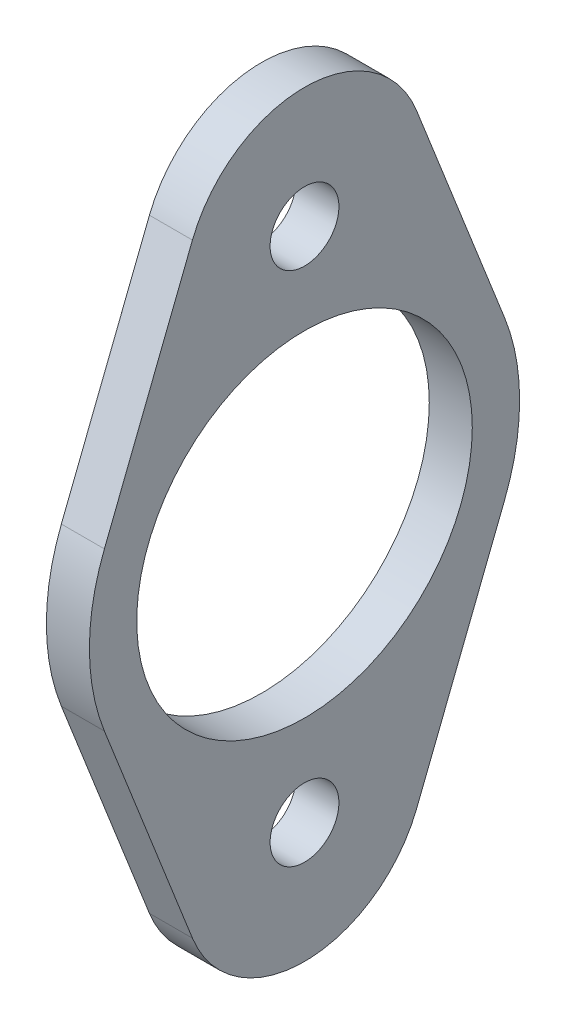
ISO-10303-21;
HEADER;
FILE_DESCRIPTION(('STEP AP214'),'2;1');
FILE_NAME('part.step','',(''),(''),'','','');
FILE_SCHEMA(('AUTOMOTIVE_DESIGN { 1 0 10303 214 1 1 1 1 }'));
ENDSEC;
DATA;
#1=APPLICATION_CONTEXT('core data for automotive mechanical design processes');
#2=APPLICATION_PROTOCOL_DEFINITION('international standard','automotive_design',2000,#1);
#3=PRODUCT_CONTEXT('',#1,'mechanical');
#4=PRODUCT('Part','Part','',(#3));
#5=PRODUCT_RELATED_PRODUCT_CATEGORY('part','',(#4));
#6=PRODUCT_DEFINITION_FORMATION('','',#4);
#7=PRODUCT_DEFINITION_CONTEXT('part definition',#1,'design');
#8=PRODUCT_DEFINITION('design','',#6,#7);
#9=PRODUCT_DEFINITION_SHAPE('','',#8);
#10=(LENGTH_UNIT() NAMED_UNIT(*) SI_UNIT(.MILLI.,.METRE.));
#11=(NAMED_UNIT(*) PLANE_ANGLE_UNIT() SI_UNIT($,.RADIAN.));
#12=(NAMED_UNIT(*) SI_UNIT($,.STERADIAN.) SOLID_ANGLE_UNIT());
#13=UNCERTAINTY_MEASURE_WITH_UNIT(LENGTH_MEASURE(1.E-05),#10,'distance_accuracy_value','');
#14=(GEOMETRIC_REPRESENTATION_CONTEXT(3) GLOBAL_UNCERTAINTY_ASSIGNED_CONTEXT((#13)) GLOBAL_UNIT_ASSIGNED_CONTEXT((#10,
#11,#12)) REPRESENTATION_CONTEXT('',''));
#15=CARTESIAN_POINT('',(0.,0.,0.));
#16=DIRECTION('',(0.,0.,1.));
#17=DIRECTION('',(1.,0.,0.));
#18=AXIS2_PLACEMENT_3D('',#15,#16,#17);
#19=CARTESIAN_POINT('',(2.5,-30.,0.));
#20=DIRECTION('',(1.,0.,0.));
#21=DIRECTION('',(0.,0.,-1.));
#22=AXIS2_PLACEMENT_3D('',#19,#20,#21);
#23=PLANE('',#22);
#24=CARTESIAN_POINT('',(2.5,30.,0.));
#25=DIRECTION('',(1.,0.,0.));
#26=DIRECTION('',(0.,0.,-1.));
#27=AXIS2_PLACEMENT_3D('',#24,#25,#26);
#28=CIRCLE('',#27,4.00000000000001);
#29=CARTESIAN_POINT('',(2.5,30.,-3.99999999999999));
#30=VERTEX_POINT('',#29);
#31=EDGE_CURVE('E188',#30,#30,#28,.T.);
#32=ORIENTED_EDGE('',*,*,#31,.F.);
#33=EDGE_LOOP('',(#32));
#34=FACE_BOUND('',#33,.T.);
#35=CARTESIAN_POINT('',(2.5,-30.,0.));
#36=DIRECTION('',(1.,0.,0.));
#37=DIRECTION('',(0.,0.,-1.));
#38=AXIS2_PLACEMENT_3D('',#35,#36,#37);
#39=CIRCLE('',#38,14.);
#40=CARTESIAN_POINT('',(2.5,-35.1333333333333,13.0249333544893));
#41=VERTEX_POINT('',#40);
#42=CARTESIAN_POINT('',(2.5,-35.1333333333333,-13.0249333544893));
#43=VERTEX_POINT('',#42);
#44=EDGE_CURVE('E151',#41,#43,#39,.T.);
#45=ORIENTED_EDGE('',*,*,#44,.T.);
#46=DIRECTION('',(0.,0.930352382463524,-0.366666666666667));
#47=VECTOR('',#46,1.);
#48=CARTESIAN_POINT('',(2.5,-35.1333333333333,-13.0249333544893));
#49=LINE('',#48,#47);
#50=CARTESIAN_POINT('',(2.5,-9.16666666666667,-23.2588095615881));
#51=VERTEX_POINT('',#50);
#52=EDGE_CURVE('E99',#43,#51,#49,.T.);
#53=ORIENTED_EDGE('',*,*,#52,.T.);
#54=CARTESIAN_POINT('',(2.5,0.,0.));
#55=DIRECTION('',(1.,0.,0.));
#56=DIRECTION('',(0.,0.,-1.));
#57=AXIS2_PLACEMENT_3D('',#54,#55,#56);
#58=CIRCLE('',#57,25.);
#59=CARTESIAN_POINT('',(2.5,9.16666666666667,-23.2588095615881));
#60=VERTEX_POINT('',#59);
#61=EDGE_CURVE('E166',#51,#60,#58,.T.);
#62=ORIENTED_EDGE('',*,*,#61,.T.);
#63=DIRECTION('',(0.,0.930352382463524,0.366666666666667));
#64=VECTOR('',#63,1.);
#65=CARTESIAN_POINT('',(2.5,9.16666666666667,-23.2588095615881));
#66=LINE('',#65,#64);
#67=CARTESIAN_POINT('',(2.5,35.1333333333333,-13.0249333544893));
#68=VERTEX_POINT('',#67);
#69=EDGE_CURVE('E179',#60,#68,#66,.T.);
#70=ORIENTED_EDGE('',*,*,#69,.T.);
#71=CARTESIAN_POINT('',(2.5,30.,0.));
#72=DIRECTION('',(1.,0.,0.));
#73=DIRECTION('',(0.,0.,-1.));
#74=AXIS2_PLACEMENT_3D('',#71,#72,#73);
#75=CIRCLE('',#74,14.);
#76=CARTESIAN_POINT('',(2.5,35.1333333333333,13.0249333544894));
#77=VERTEX_POINT('',#76);
#78=EDGE_CURVE('E118',#68,#77,#75,.T.);
#79=ORIENTED_EDGE('',*,*,#78,.T.);
#80=DIRECTION('',(0.,-0.930352382463524,0.366666666666666));
#81=VECTOR('',#80,1.);
#82=CARTESIAN_POINT('',(2.5,9.16666666666666,23.2588095615881));
#83=LINE('',#82,#81);
#84=CARTESIAN_POINT('',(2.5,9.16666666666666,23.2588095615881));
#85=VERTEX_POINT('',#84);
#86=EDGE_CURVE('E112',#77,#85,#83,.T.);
#87=ORIENTED_EDGE('',*,*,#86,.T.);
#88=CARTESIAN_POINT('',(2.5,0.,0.));
#89=DIRECTION('',(1.,0.,0.));
#90=DIRECTION('',(0.,0.,-1.));
#91=AXIS2_PLACEMENT_3D('',#88,#89,#90);
#92=CIRCLE('',#91,25.);
#93=CARTESIAN_POINT('',(2.5,-9.16666666666666,23.2588095615881));
#94=VERTEX_POINT('',#93);
#95=EDGE_CURVE('E116',#85,#94,#92,.T.);
#96=ORIENTED_EDGE('',*,*,#95,.T.);
#97=DIRECTION('',(0.,-0.930352382463524,-0.366666666666666));
#98=VECTOR('',#97,1.);
#99=CARTESIAN_POINT('',(2.5,-35.1333333333333,13.0249333544893));
#100=LINE('',#99,#98);
#101=EDGE_CURVE('E56',#94,#41,#100,.T.);
#102=ORIENTED_EDGE('',*,*,#101,.T.);
#103=EDGE_LOOP('',(#45,#53,#62,#70,#79,#87,#96,#102));
#104=FACE_BOUND('',#103,.T.);
#105=CARTESIAN_POINT('',(2.5,0.,0.));
#106=DIRECTION('',(1.,0.,0.));
#107=DIRECTION('',(0.,0.,-1.));
#108=AXIS2_PLACEMENT_3D('',#105,#106,#107);
#109=CIRCLE('',#108,19.5);
#110=CARTESIAN_POINT('',(2.5,0.,-19.5));
#111=VERTEX_POINT('',#110);
#112=EDGE_CURVE('E140',#111,#111,#109,.T.);
#113=ORIENTED_EDGE('',*,*,#112,.F.);
#114=EDGE_LOOP('',(#113));
#115=FACE_BOUND('',#114,.T.);
#116=CARTESIAN_POINT('',(2.5,-30.,0.));
#117=DIRECTION('',(1.,0.,0.));
#118=DIRECTION('',(0.,0.,-1.));
#119=AXIS2_PLACEMENT_3D('',#116,#117,#118);
#120=CIRCLE('',#119,4.00000000000001);
#121=CARTESIAN_POINT('',(2.5,-30.,-4.00000000000001));
#122=VERTEX_POINT('',#121);
#123=EDGE_CURVE('E194',#122,#122,#120,.T.);
#124=ORIENTED_EDGE('',*,*,#123,.F.);
#125=EDGE_LOOP('',(#124));
#126=FACE_BOUND('',#125,.T.);
#127=ADVANCED_FACE('F39',(#34,#104,#115,#126),#23,.T.);
#128=CARTESIAN_POINT('',(-2.5,-30.,0.));
#129=DIRECTION('',(1.,0.,0.));
#130=DIRECTION('',(0.,0.,-1.));
#131=AXIS2_PLACEMENT_3D('',#128,#129,#130);
#132=PLANE('',#131);
#133=CARTESIAN_POINT('',(-2.5,-30.,0.));
#134=DIRECTION('',(1.,0.,0.));
#135=DIRECTION('',(0.,0.,-1.));
#136=AXIS2_PLACEMENT_3D('',#133,#134,#135);
#137=CIRCLE('',#136,14.);
#138=CARTESIAN_POINT('',(-2.5,-35.1333333333333,13.0249333544893));
#139=VERTEX_POINT('',#138);
#140=CARTESIAN_POINT('',(-2.5,-35.1333333333333,-13.0249333544893));
#141=VERTEX_POINT('',#140);
#142=EDGE_CURVE('E136',#139,#141,#137,.T.);
#143=ORIENTED_EDGE('',*,*,#142,.F.);
#144=DIRECTION('',(0.,-0.930352382463524,-0.366666666666666));
#145=VECTOR('',#144,1.);
#146=CARTESIAN_POINT('',(-2.5,-35.1333333333333,13.0249333544893));
#147=LINE('',#146,#145);
#148=CARTESIAN_POINT('',(-2.5,-9.16666666666666,23.2588095615881));
#149=VERTEX_POINT('',#148);
#150=EDGE_CURVE('E91',#149,#139,#147,.T.);
#151=ORIENTED_EDGE('',*,*,#150,.F.);
#152=CARTESIAN_POINT('',(-2.5,0.,0.));
#153=DIRECTION('',(1.,0.,0.));
#154=DIRECTION('',(0.,0.,-1.));
#155=AXIS2_PLACEMENT_3D('',#152,#153,#154);
#156=CIRCLE('',#155,25.);
#157=CARTESIAN_POINT('',(-2.5,9.16666666666666,23.2588095615881));
#158=VERTEX_POINT('',#157);
#159=EDGE_CURVE('E85',#158,#149,#156,.T.);
#160=ORIENTED_EDGE('',*,*,#159,.F.);
#161=DIRECTION('',(0.,-0.930352382463524,0.366666666666666));
#162=VECTOR('',#161,1.);
#163=CARTESIAN_POINT('',(-2.5,9.16666666666666,23.2588095615881));
#164=LINE('',#163,#162);
#165=CARTESIAN_POINT('',(-2.5,35.1333333333333,13.0249333544894));
#166=VERTEX_POINT('',#165);
#167=EDGE_CURVE('E126',#166,#158,#164,.T.);
#168=ORIENTED_EDGE('',*,*,#167,.F.);
#169=CARTESIAN_POINT('',(-2.5,30.,0.));
#170=DIRECTION('',(1.,0.,0.));
#171=DIRECTION('',(0.,0.,-1.));
#172=AXIS2_PLACEMENT_3D('',#169,#170,#171);
#173=CIRCLE('',#172,14.);
#174=CARTESIAN_POINT('',(-2.5,35.1333333333333,-13.0249333544893));
#175=VERTEX_POINT('',#174);
#176=EDGE_CURVE('E146',#175,#166,#173,.T.);
#177=ORIENTED_EDGE('',*,*,#176,.F.);
#178=DIRECTION('',(0.,0.930352382463524,0.366666666666667));
#179=VECTOR('',#178,1.);
#180=CARTESIAN_POINT('',(-2.5,9.16666666666667,-23.2588095615881));
#181=LINE('',#180,#179);
#182=CARTESIAN_POINT('',(-2.5,9.16666666666667,-23.2588095615881));
#183=VERTEX_POINT('',#182);
#184=EDGE_CURVE('E144',#183,#175,#181,.T.);
#185=ORIENTED_EDGE('',*,*,#184,.F.);
#186=CARTESIAN_POINT('',(-2.5,0.,0.));
#187=DIRECTION('',(1.,0.,0.));
#188=DIRECTION('',(0.,0.,-1.));
#189=AXIS2_PLACEMENT_3D('',#186,#187,#188);
#190=CIRCLE('',#189,25.);
#191=CARTESIAN_POINT('',(-2.5,-9.16666666666667,-23.2588095615881));
#192=VERTEX_POINT('',#191);
#193=EDGE_CURVE('E142',#192,#183,#190,.T.);
#194=ORIENTED_EDGE('',*,*,#193,.F.);
#195=DIRECTION('',(0.,0.930352382463524,-0.366666666666667));
#196=VECTOR('',#195,1.);
#197=CARTESIAN_POINT('',(-2.5,-35.1333333333333,-13.0249333544893));
#198=LINE('',#197,#196);
#199=EDGE_CURVE('E139',#141,#192,#198,.T.);
#200=ORIENTED_EDGE('',*,*,#199,.F.);
#201=EDGE_LOOP('',(#143,#151,#160,#168,#177,#185,#194,#200));
#202=FACE_BOUND('',#201,.T.);
#203=CARTESIAN_POINT('',(-2.5,0.,0.));
#204=DIRECTION('',(1.,0.,0.));
#205=DIRECTION('',(0.,0.,-1.));
#206=AXIS2_PLACEMENT_3D('',#203,#204,#205);
#207=CIRCLE('',#206,19.5);
#208=CARTESIAN_POINT('',(-2.5,0.,-19.5));
#209=VERTEX_POINT('',#208);
#210=EDGE_CURVE('E185',#209,#209,#207,.T.);
#211=ORIENTED_EDGE('',*,*,#210,.T.);
#212=EDGE_LOOP('',(#211));
#213=FACE_BOUND('',#212,.T.);
#214=CARTESIAN_POINT('',(-2.5,30.,0.));
#215=DIRECTION('',(1.,0.,0.));
#216=DIRECTION('',(0.,0.,-1.));
#217=AXIS2_PLACEMENT_3D('',#214,#215,#216);
#218=CIRCLE('',#217,4.00000000000001);
#219=CARTESIAN_POINT('',(-2.5,30.,-3.99999999999999));
#220=VERTEX_POINT('',#219);
#221=EDGE_CURVE('E191',#220,#220,#218,.T.);
#222=ORIENTED_EDGE('',*,*,#221,.T.);
#223=EDGE_LOOP('',(#222));
#224=FACE_BOUND('',#223,.T.);
#225=CARTESIAN_POINT('',(-2.5,-30.,0.));
#226=DIRECTION('',(1.,0.,0.));
#227=DIRECTION('',(0.,0.,-1.));
#228=AXIS2_PLACEMENT_3D('',#225,#226,#227);
#229=CIRCLE('',#228,4.00000000000001);
#230=CARTESIAN_POINT('',(-2.5,-30.,-4.00000000000001));
#231=VERTEX_POINT('',#230);
#232=EDGE_CURVE('E197',#231,#231,#229,.T.);
#233=ORIENTED_EDGE('',*,*,#232,.T.);
#234=EDGE_LOOP('',(#233));
#235=FACE_BOUND('',#234,.T.);
#236=ADVANCED_FACE('F170',(#202,#213,#224,#235),#132,.F.);
#237=CARTESIAN_POINT('',(2.5,-30.,0.));
#238=DIRECTION('',(-1.,0.,0.));
#239=DIRECTION('',(0.,0.,1.));
#240=AXIS2_PLACEMENT_3D('',#237,#238,#239);
#241=CYLINDRICAL_SURFACE('',#240,14.);
#242=ORIENTED_EDGE('',*,*,#142,.T.);
#243=DIRECTION('',(-1.,0.,0.));
#244=VECTOR('',#243,1.);
#245=CARTESIAN_POINT('',(2.5,-35.1333333333333,-13.0249333544893));
#246=LINE('',#245,#244);
#247=EDGE_CURVE('E11',#43,#141,#246,.T.);
#248=ORIENTED_EDGE('',*,*,#247,.F.);
#249=ORIENTED_EDGE('',*,*,#44,.F.);
#250=DIRECTION('',(-1.,0.,0.));
#251=VECTOR('',#250,1.);
#252=CARTESIAN_POINT('',(2.5,-35.1333333333333,13.0249333544893));
#253=LINE('',#252,#251);
#254=EDGE_CURVE('E132',#41,#139,#253,.T.);
#255=ORIENTED_EDGE('',*,*,#254,.T.);
#256=EDGE_LOOP('',(#242,#248,#249,#255));
#257=FACE_BOUND('',#256,.T.);
#258=ADVANCED_FACE('F41',(#257),#241,.T.);
#259=CARTESIAN_POINT('',(2.5,-35.1333333333333,-13.0249333544893));
#260=DIRECTION('',(0.,0.366666666666667,0.930352382463524));
#261=DIRECTION('',(0.,-0.930352382463524,0.366666666666667));
#262=AXIS2_PLACEMENT_3D('',#259,#260,#261);
#263=PLANE('',#262);
#264=ORIENTED_EDGE('',*,*,#199,.T.);
#265=DIRECTION('',(-1.,0.,0.));
#266=VECTOR('',#265,1.);
#267=CARTESIAN_POINT('',(2.5,-9.16666666666667,-23.2588095615881));
#268=LINE('',#267,#266);
#269=EDGE_CURVE('E48',#51,#192,#268,.T.);
#270=ORIENTED_EDGE('',*,*,#269,.F.);
#271=ORIENTED_EDGE('',*,*,#52,.F.);
#272=ORIENTED_EDGE('',*,*,#247,.T.);
#273=EDGE_LOOP('',(#264,#270,#271,#272));
#274=FACE_BOUND('',#273,.T.);
#275=ADVANCED_FACE('F230',(#274),#263,.F.);
#276=CARTESIAN_POINT('',(2.5,0.,0.));
#277=DIRECTION('',(-1.,0.,0.));
#278=DIRECTION('',(0.,0.,1.));
#279=AXIS2_PLACEMENT_3D('',#276,#277,#278);
#280=CYLINDRICAL_SURFACE('',#279,25.);
#281=ORIENTED_EDGE('',*,*,#193,.T.);
#282=DIRECTION('',(-1.,0.,0.));
#283=VECTOR('',#282,1.);
#284=CARTESIAN_POINT('',(2.5,9.16666666666667,-23.2588095615881));
#285=LINE('',#284,#283);
#286=EDGE_CURVE('E158',#60,#183,#285,.T.);
#287=ORIENTED_EDGE('',*,*,#286,.F.);
#288=ORIENTED_EDGE('',*,*,#61,.F.);
#289=ORIENTED_EDGE('',*,*,#269,.T.);
#290=EDGE_LOOP('',(#281,#287,#288,#289));
#291=FACE_BOUND('',#290,.T.);
#292=ADVANCED_FACE('F164',(#291),#280,.T.);
#293=CARTESIAN_POINT('',(2.5,9.16666666666667,-23.2588095615881));
#294=DIRECTION('',(0.,-0.366666666666667,0.930352382463524));
#295=DIRECTION('',(0.,-0.930352382463524,-0.366666666666667));
#296=AXIS2_PLACEMENT_3D('',#293,#294,#295);
#297=PLANE('',#296);
#298=ORIENTED_EDGE('',*,*,#184,.T.);
#299=DIRECTION('',(-1.,0.,0.));
#300=VECTOR('',#299,1.);
#301=CARTESIAN_POINT('',(2.5,35.1333333333333,-13.0249333544893));
#302=LINE('',#301,#300);
#303=EDGE_CURVE('E155',#68,#175,#302,.T.);
#304=ORIENTED_EDGE('',*,*,#303,.F.);
#305=ORIENTED_EDGE('',*,*,#69,.F.);
#306=ORIENTED_EDGE('',*,*,#286,.T.);
#307=EDGE_LOOP('',(#298,#304,#305,#306));
#308=FACE_BOUND('',#307,.T.);
#309=ADVANCED_FACE('F175',(#308),#297,.F.);
#310=CARTESIAN_POINT('',(2.5,30.,0.));
#311=DIRECTION('',(-1.,0.,0.));
#312=DIRECTION('',(0.,0.,1.));
#313=AXIS2_PLACEMENT_3D('',#310,#311,#312);
#314=CYLINDRICAL_SURFACE('',#313,14.);
#315=ORIENTED_EDGE('',*,*,#176,.T.);
#316=DIRECTION('',(-1.,0.,0.));
#317=VECTOR('',#316,1.);
#318=CARTESIAN_POINT('',(2.5,35.1333333333333,13.0249333544894));
#319=LINE('',#318,#317);
#320=EDGE_CURVE('E127',#77,#166,#319,.T.);
#321=ORIENTED_EDGE('',*,*,#320,.F.);
#322=ORIENTED_EDGE('',*,*,#78,.F.);
#323=ORIENTED_EDGE('',*,*,#303,.T.);
#324=EDGE_LOOP('',(#315,#321,#322,#323));
#325=FACE_BOUND('',#324,.T.);
#326=ADVANCED_FACE('F178',(#325),#314,.T.);
#327=CARTESIAN_POINT('',(2.5,9.16666666666666,23.2588095615881));
#328=DIRECTION('',(0.,-0.366666666666666,-0.930352382463524));
#329=DIRECTION('',(0.,0.930352382463524,-0.366666666666666));
#330=AXIS2_PLACEMENT_3D('',#327,#328,#329);
#331=PLANE('',#330);
#332=ORIENTED_EDGE('',*,*,#167,.T.);
#333=DIRECTION('',(-1.,0.,0.));
#334=VECTOR('',#333,1.);
#335=CARTESIAN_POINT('',(2.5,9.16666666666666,23.2588095615881));
#336=LINE('',#335,#334);
#337=EDGE_CURVE('E123',#85,#158,#336,.T.);
#338=ORIENTED_EDGE('',*,*,#337,.F.);
#339=ORIENTED_EDGE('',*,*,#86,.F.);
#340=ORIENTED_EDGE('',*,*,#320,.T.);
#341=EDGE_LOOP('',(#332,#338,#339,#340));
#342=FACE_BOUND('',#341,.T.);
#343=ADVANCED_FACE('F124',(#342),#331,.F.);
#344=CARTESIAN_POINT('',(2.5,0.,0.));
#345=DIRECTION('',(-1.,0.,0.));
#346=DIRECTION('',(0.,0.,1.));
#347=AXIS2_PLACEMENT_3D('',#344,#345,#346);
#348=CYLINDRICAL_SURFACE('',#347,25.);
#349=ORIENTED_EDGE('',*,*,#159,.T.);
#350=DIRECTION('',(-1.,0.,0.));
#351=VECTOR('',#350,1.);
#352=CARTESIAN_POINT('',(2.5,-9.16666666666666,23.2588095615881));
#353=LINE('',#352,#351);
#354=EDGE_CURVE('E128',#94,#149,#353,.T.);
#355=ORIENTED_EDGE('',*,*,#354,.F.);
#356=ORIENTED_EDGE('',*,*,#95,.F.);
#357=ORIENTED_EDGE('',*,*,#337,.T.);
#358=EDGE_LOOP('',(#349,#355,#356,#357));
#359=FACE_BOUND('',#358,.T.);
#360=ADVANCED_FACE('F130',(#359),#348,.T.);
#361=CARTESIAN_POINT('',(2.5,-35.1333333333333,13.0249333544893));
#362=DIRECTION('',(0.,0.366666666666666,-0.930352382463524));
#363=DIRECTION('',(0.,0.930352382463524,0.366666666666666));
#364=AXIS2_PLACEMENT_3D('',#361,#362,#363);
#365=PLANE('',#364);
#366=ORIENTED_EDGE('',*,*,#150,.T.);
#367=ORIENTED_EDGE('',*,*,#254,.F.);
#368=ORIENTED_EDGE('',*,*,#101,.F.);
#369=ORIENTED_EDGE('',*,*,#354,.T.);
#370=EDGE_LOOP('',(#366,#367,#368,#369));
#371=FACE_BOUND('',#370,.T.);
#372=ADVANCED_FACE('F218',(#371),#365,.F.);
#373=CARTESIAN_POINT('',(2.5,0.,0.));
#374=DIRECTION('',(-1.,0.,0.));
#375=DIRECTION('',(0.,0.,1.));
#376=AXIS2_PLACEMENT_3D('',#373,#374,#375);
#377=CYLINDRICAL_SURFACE('',#376,19.5);
#378=ORIENTED_EDGE('',*,*,#112,.T.);
#379=EDGE_LOOP('',(#378));
#380=FACE_BOUND('',#379,.T.);
#381=ORIENTED_EDGE('',*,*,#210,.F.);
#382=EDGE_LOOP('',(#381));
#383=FACE_BOUND('',#382,.T.);
#384=ADVANCED_FACE('F215',(#380,#383),#377,.F.);
#385=CARTESIAN_POINT('',(2.5,30.,0.));
#386=DIRECTION('',(-1.,0.,0.));
#387=DIRECTION('',(0.,0.,1.));
#388=AXIS2_PLACEMENT_3D('',#385,#386,#387);
#389=CYLINDRICAL_SURFACE('',#388,4.00000000000001);
#390=ORIENTED_EDGE('',*,*,#31,.T.);
#391=EDGE_LOOP('',(#390));
#392=FACE_BOUND('',#391,.T.);
#393=ORIENTED_EDGE('',*,*,#221,.F.);
#394=EDGE_LOOP('',(#393));
#395=FACE_BOUND('',#394,.T.);
#396=ADVANCED_FACE('F293',(#392,#395),#389,.F.);
#397=CARTESIAN_POINT('',(2.5,-30.,0.));
#398=DIRECTION('',(-1.,0.,0.));
#399=DIRECTION('',(0.,0.,1.));
#400=AXIS2_PLACEMENT_3D('',#397,#398,#399);
#401=CYLINDRICAL_SURFACE('',#400,4.00000000000001);
#402=ORIENTED_EDGE('',*,*,#123,.T.);
#403=EDGE_LOOP('',(#402));
#404=FACE_BOUND('',#403,.T.);
#405=ORIENTED_EDGE('',*,*,#232,.F.);
#406=EDGE_LOOP('',(#405));
#407=FACE_BOUND('',#406,.T.);
#408=ADVANCED_FACE('F203',(#404,#407),#401,.F.);
#409=CLOSED_SHELL('',(#127,#236,#258,#275,#292,#309,#326,#343,#360,#372,#384,#396,#408));
#410=MANIFOLD_SOLID_BREP('B2',#409);
#411=ADVANCED_BREP_SHAPE_REPRESENTATION('',(#18,#410),#14);
#412=SHAPE_DEFINITION_REPRESENTATION(#9,#411);
ENDSEC;
END-ISO-10303-21;
